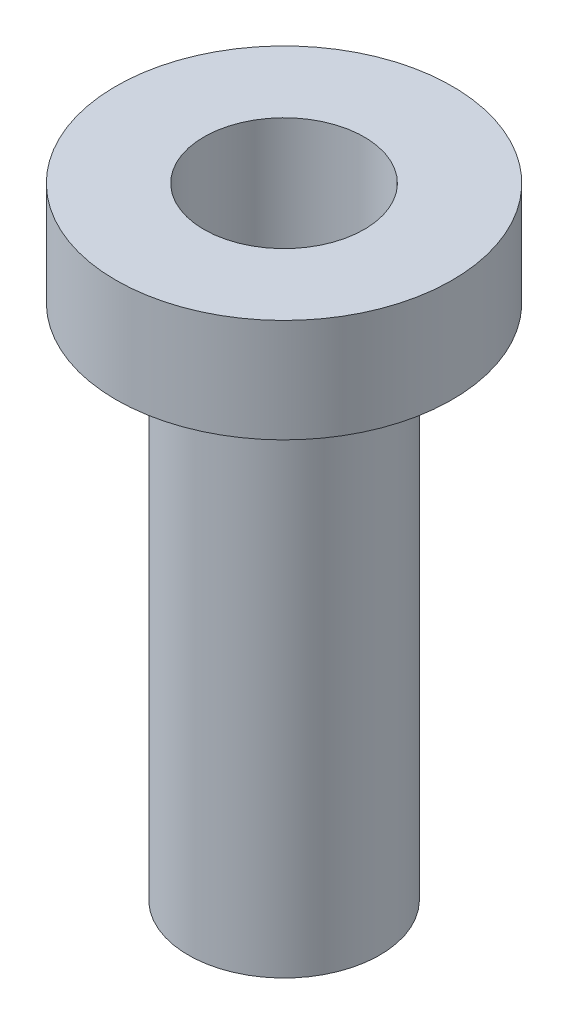
ISO-10303-21;
HEADER;
FILE_DESCRIPTION(('STEP AP214'),'2;1');
FILE_NAME('part.step','',(''),(''),'','','');
FILE_SCHEMA(('AUTOMOTIVE_DESIGN { 1 0 10303 214 1 1 1 1 }'));
ENDSEC;
DATA;
#1=APPLICATION_CONTEXT('core data for automotive mechanical design processes');
#2=APPLICATION_PROTOCOL_DEFINITION('international standard','automotive_design',2000,#1);
#3=PRODUCT_CONTEXT('',#1,'mechanical');
#4=PRODUCT('Part','Part','',(#3));
#5=PRODUCT_RELATED_PRODUCT_CATEGORY('part','',(#4));
#6=PRODUCT_DEFINITION_FORMATION('','',#4);
#7=PRODUCT_DEFINITION_CONTEXT('part definition',#1,'design');
#8=PRODUCT_DEFINITION('design','',#6,#7);
#9=PRODUCT_DEFINITION_SHAPE('','',#8);
#10=(LENGTH_UNIT() NAMED_UNIT(*) SI_UNIT(.MILLI.,.METRE.));
#11=(NAMED_UNIT(*) PLANE_ANGLE_UNIT() SI_UNIT($,.RADIAN.));
#12=(NAMED_UNIT(*) SI_UNIT($,.STERADIAN.) SOLID_ANGLE_UNIT());
#13=UNCERTAINTY_MEASURE_WITH_UNIT(LENGTH_MEASURE(1.E-05),#10,'distance_accuracy_value','');
#14=(GEOMETRIC_REPRESENTATION_CONTEXT(3) GLOBAL_UNCERTAINTY_ASSIGNED_CONTEXT((#13)) GLOBAL_UNIT_ASSIGNED_CONTEXT((#10,
#11,#12)) REPRESENTATION_CONTEXT('',''));
#15=CARTESIAN_POINT('',(0.,0.,0.));
#16=DIRECTION('',(0.,0.,1.));
#17=DIRECTION('',(1.,0.,0.));
#18=AXIS2_PLACEMENT_3D('',#15,#16,#17);
#19=CARTESIAN_POINT('',(0.,2.,0.));
#20=DIRECTION('',(0.,-1.,0.));
#21=DIRECTION('',(0.,0.,-1.));
#22=AXIS2_PLACEMENT_3D('',#19,#20,#21);
#23=CYLINDRICAL_SURFACE('',#22,3.25);
#24=CARTESIAN_POINT('',(0.,2.,0.));
#25=DIRECTION('',(0.,1.,0.));
#26=DIRECTION('',(0.,0.,1.));
#27=AXIS2_PLACEMENT_3D('',#24,#25,#26);
#28=CIRCLE('',#27,3.25);
#29=CARTESIAN_POINT('',(0.,2.,3.25));
#30=VERTEX_POINT('',#29);
#31=EDGE_CURVE('E37',#30,#30,#28,.T.);
#32=ORIENTED_EDGE('',*,*,#31,.F.);
#33=EDGE_LOOP('',(#32));
#34=FACE_BOUND('',#33,.T.);
#35=CARTESIAN_POINT('',(0.,0.,0.));
#36=DIRECTION('',(0.,1.,0.));
#37=DIRECTION('',(0.,0.,1.));
#38=AXIS2_PLACEMENT_3D('',#35,#36,#37);
#39=CIRCLE('',#38,3.25);
#40=CARTESIAN_POINT('',(0.,0.,3.25));
#41=VERTEX_POINT('',#40);
#42=EDGE_CURVE('E33',#41,#41,#39,.T.);
#43=ORIENTED_EDGE('',*,*,#42,.T.);
#44=EDGE_LOOP('',(#43));
#45=FACE_BOUND('',#44,.T.);
#46=ADVANCED_FACE('F30',(#34,#45),#23,.T.);
#47=CARTESIAN_POINT('',(0.,2.,0.));
#48=DIRECTION('',(0.,1.,0.));
#49=DIRECTION('',(0.,0.,1.));
#50=AXIS2_PLACEMENT_3D('',#47,#48,#49);
#51=PLANE('',#50);
#52=CARTESIAN_POINT('',(0.,2.,0.));
#53=DIRECTION('',(0.,1.,0.));
#54=DIRECTION('',(0.,0.,1.));
#55=AXIS2_PLACEMENT_3D('',#52,#53,#54);
#56=CIRCLE('',#55,1.55);
#57=CARTESIAN_POINT('',(0.,2.,1.55));
#58=VERTEX_POINT('',#57);
#59=EDGE_CURVE('E47',#58,#58,#56,.T.);
#60=ORIENTED_EDGE('',*,*,#59,.F.);
#61=EDGE_LOOP('',(#60));
#62=FACE_BOUND('',#61,.T.);
#63=ORIENTED_EDGE('',*,*,#31,.T.);
#64=EDGE_LOOP('',(#63));
#65=FACE_BOUND('',#64,.T.);
#66=ADVANCED_FACE('F62',(#62,#65),#51,.T.);
#67=CARTESIAN_POINT('',(0.,0.,0.));
#68=DIRECTION('',(0.,1.,0.));
#69=DIRECTION('',(0.,0.,1.));
#70=AXIS2_PLACEMENT_3D('',#67,#68,#69);
#71=PLANE('',#70);
#72=CARTESIAN_POINT('',(0.,0.,0.));
#73=DIRECTION('',(0.,-1.,0.));
#74=DIRECTION('',(0.,0.,-1.));
#75=AXIS2_PLACEMENT_3D('',#72,#73,#74);
#76=CIRCLE('',#75,1.85);
#77=CARTESIAN_POINT('',(0.,0.,-1.85));
#78=VERTEX_POINT('',#77);
#79=EDGE_CURVE('E10',#78,#78,#76,.T.);
#80=ORIENTED_EDGE('',*,*,#79,.F.);
#81=EDGE_LOOP('',(#80));
#82=FACE_BOUND('',#81,.T.);
#83=ORIENTED_EDGE('',*,*,#42,.F.);
#84=EDGE_LOOP('',(#83));
#85=FACE_BOUND('',#84,.T.);
#86=ADVANCED_FACE('F65',(#82,#85),#71,.F.);
#87=CARTESIAN_POINT('',(0.,-10.,0.));
#88=DIRECTION('',(0.,1.,0.));
#89=DIRECTION('',(0.,0.,1.));
#90=AXIS2_PLACEMENT_3D('',#87,#88,#89);
#91=CYLINDRICAL_SURFACE('',#90,1.85);
#92=CARTESIAN_POINT('',(0.,-10.,0.));
#93=DIRECTION('',(0.,-1.,0.));
#94=DIRECTION('',(0.,0.,-1.));
#95=AXIS2_PLACEMENT_3D('',#92,#93,#94);
#96=CIRCLE('',#95,1.85);
#97=CARTESIAN_POINT('',(0.,-10.,-1.85));
#98=VERTEX_POINT('',#97);
#99=EDGE_CURVE('E43',#98,#98,#96,.T.);
#100=ORIENTED_EDGE('',*,*,#99,.F.);
#101=EDGE_LOOP('',(#100));
#102=FACE_BOUND('',#101,.T.);
#103=ORIENTED_EDGE('',*,*,#79,.T.);
#104=EDGE_LOOP('',(#103));
#105=FACE_BOUND('',#104,.T.);
#106=ADVANCED_FACE('F75',(#102,#105),#91,.T.);
#107=CARTESIAN_POINT('',(0.,-10.,0.));
#108=DIRECTION('',(0.,-1.,0.));
#109=DIRECTION('',(0.,0.,-1.));
#110=AXIS2_PLACEMENT_3D('',#107,#108,#109);
#111=PLANE('',#110);
#112=CARTESIAN_POINT('',(0.,-10.,0.));
#113=DIRECTION('',(0.,1.,0.));
#114=DIRECTION('',(0.,0.,1.));
#115=AXIS2_PLACEMENT_3D('',#112,#113,#114);
#116=CIRCLE('',#115,1.55);
#117=CARTESIAN_POINT('',(0.,-10.,1.55));
#118=VERTEX_POINT('',#117);
#119=EDGE_CURVE('E46',#118,#118,#116,.T.);
#120=ORIENTED_EDGE('',*,*,#119,.T.);
#121=EDGE_LOOP('',(#120));
#122=FACE_BOUND('',#121,.T.);
#123=ORIENTED_EDGE('',*,*,#99,.T.);
#124=EDGE_LOOP('',(#123));
#125=FACE_BOUND('',#124,.T.);
#126=ADVANCED_FACE('F53',(#122,#125),#111,.T.);
#127=CARTESIAN_POINT('',(0.,-10.,0.));
#128=DIRECTION('',(0.,1.,0.));
#129=DIRECTION('',(0.,0.,1.));
#130=AXIS2_PLACEMENT_3D('',#127,#128,#129);
#131=CYLINDRICAL_SURFACE('',#130,1.55);
#132=ORIENTED_EDGE('',*,*,#119,.F.);
#133=EDGE_LOOP('',(#132));
#134=FACE_BOUND('',#133,.T.);
#135=ORIENTED_EDGE('',*,*,#59,.T.);
#136=EDGE_LOOP('',(#135));
#137=FACE_BOUND('',#136,.T.);
#138=ADVANCED_FACE('F56',(#134,#137),#131,.F.);
#139=CLOSED_SHELL('',(#46,#66,#86,#106,#126,#138));
#140=MANIFOLD_SOLID_BREP('B2',#139);
#141=ADVANCED_BREP_SHAPE_REPRESENTATION('',(#18,#140),#14);
#142=SHAPE_DEFINITION_REPRESENTATION(#9,#141);
ENDSEC;
END-ISO-10303-21;
